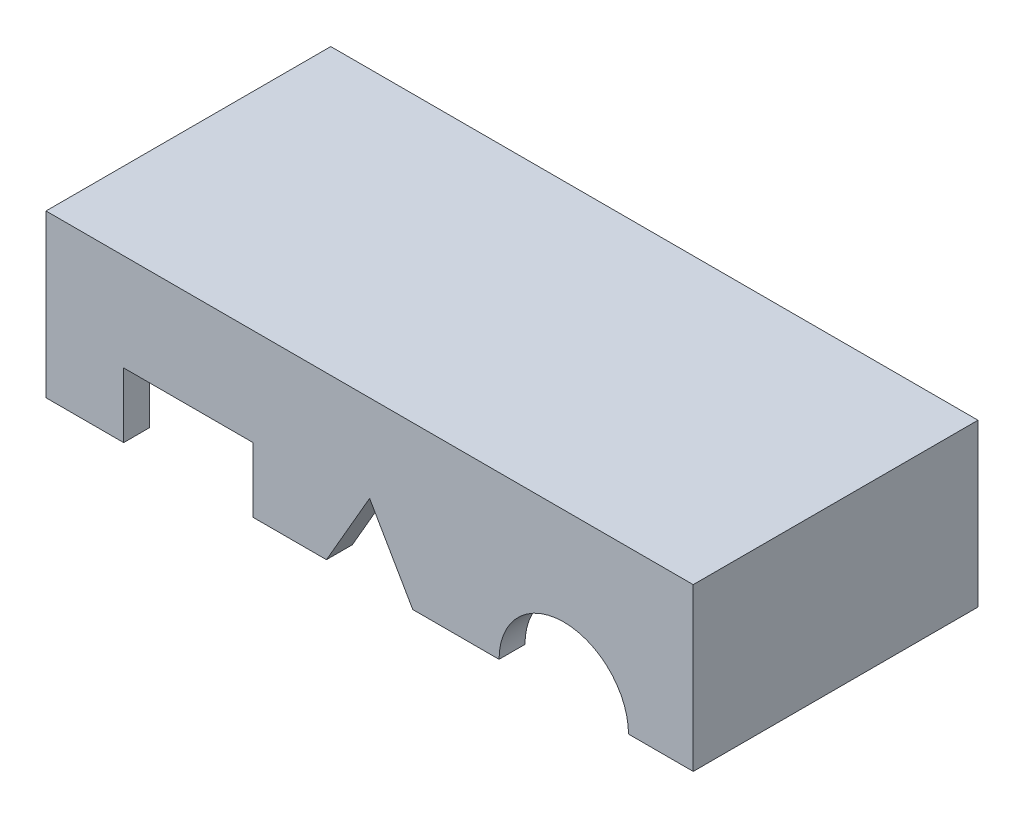
ISO-10303-21;
HEADER;
FILE_DESCRIPTION(('STEP AP214'),'2;1');
FILE_NAME('part.step','',(''),(''),'','','');
FILE_SCHEMA(('AUTOMOTIVE_DESIGN { 1 0 10303 214 1 1 1 1 }'));
ENDSEC;
DATA;
#1=APPLICATION_CONTEXT('core data for automotive mechanical design processes');
#2=APPLICATION_PROTOCOL_DEFINITION('international standard','automotive_design',2000,#1);
#3=PRODUCT_CONTEXT('',#1,'mechanical');
#4=PRODUCT('Part','Part','',(#3));
#5=PRODUCT_RELATED_PRODUCT_CATEGORY('part','',(#4));
#6=PRODUCT_DEFINITION_FORMATION('','',#4);
#7=PRODUCT_DEFINITION_CONTEXT('part definition',#1,'design');
#8=PRODUCT_DEFINITION('design','',#6,#7);
#9=PRODUCT_DEFINITION_SHAPE('','',#8);
#10=(LENGTH_UNIT() NAMED_UNIT(*) SI_UNIT(.MILLI.,.METRE.));
#11=(NAMED_UNIT(*) PLANE_ANGLE_UNIT() SI_UNIT($,.RADIAN.));
#12=(NAMED_UNIT(*) SI_UNIT($,.STERADIAN.) SOLID_ANGLE_UNIT());
#13=UNCERTAINTY_MEASURE_WITH_UNIT(LENGTH_MEASURE(1.E-05),#10,'distance_accuracy_value','');
#14=(GEOMETRIC_REPRESENTATION_CONTEXT(3) GLOBAL_UNCERTAINTY_ASSIGNED_CONTEXT((#13)) GLOBAL_UNIT_ASSIGNED_CONTEXT((#10,
#11,#12)) REPRESENTATION_CONTEXT('',''));
#15=CARTESIAN_POINT('',(0.,0.,0.));
#16=DIRECTION('',(0.,0.,1.));
#17=DIRECTION('',(1.,0.,0.));
#18=AXIS2_PLACEMENT_3D('',#15,#16,#17);
#19=CARTESIAN_POINT('',(0.,0.,0.));
#20=DIRECTION('',(0.,0.,1.));
#21=DIRECTION('',(1.,0.,0.));
#22=AXIS2_PLACEMENT_3D('',#19,#20,#21);
#23=PLANE('',#22);
#24=DIRECTION('',(0.,1.,0.));
#25=VECTOR('',#24,1.);
#26=CARTESIAN_POINT('',(125.,-62.5,0.));
#27=LINE('',#26,#25);
#28=CARTESIAN_POINT('',(125.,0.,0.));
#29=VERTEX_POINT('',#28);
#30=CARTESIAN_POINT('',(125.,62.5,0.));
#31=VERTEX_POINT('',#30);
#32=EDGE_CURVE('E250',#29,#31,#27,.T.);
#33=ORIENTED_EDGE('',*,*,#32,.F.);
#34=DIRECTION('',(-1.,0.,0.));
#35=VECTOR('',#34,1.);
#36=CARTESIAN_POINT('',(0.,0.,0.));
#37=LINE('',#36,#35);
#38=CARTESIAN_POINT('',(115.,0.,0.));
#39=VERTEX_POINT('',#38);
#40=EDGE_CURVE('E330',#29,#39,#37,.T.);
#41=ORIENTED_EDGE('',*,*,#40,.T.);
#42=DIRECTION('',(0.,1.,0.));
#43=VECTOR('',#42,1.);
#44=CARTESIAN_POINT('',(115.,-57.5,0.));
#45=LINE('',#44,#43);
#46=CARTESIAN_POINT('',(115.,57.5,0.));
#47=VERTEX_POINT('',#46);
#48=EDGE_CURVE('E233',#39,#47,#45,.T.);
#49=ORIENTED_EDGE('',*,*,#48,.T.);
#50=DIRECTION('',(-1.,0.,0.));
#51=VECTOR('',#50,1.);
#52=CARTESIAN_POINT('',(115.,57.5,0.));
#53=LINE('',#52,#51);
#54=CARTESIAN_POINT('',(-115.,57.5,0.));
#55=VERTEX_POINT('',#54);
#56=EDGE_CURVE('E222',#47,#55,#53,.T.);
#57=ORIENTED_EDGE('',*,*,#56,.T.);
#58=DIRECTION('',(0.,-1.,0.));
#59=VECTOR('',#58,1.);
#60=CARTESIAN_POINT('',(-115.,-57.5,0.));
#61=LINE('',#60,#59);
#62=CARTESIAN_POINT('',(-115.,0.,0.));
#63=VERTEX_POINT('',#62);
#64=EDGE_CURVE('E209',#55,#63,#61,.T.);
#65=ORIENTED_EDGE('',*,*,#64,.T.);
#66=CARTESIAN_POINT('',(-125.,0.,0.));
#67=VERTEX_POINT('',#66);
#68=EDGE_CURVE('E275',#63,#67,#37,.T.);
#69=ORIENTED_EDGE('',*,*,#68,.T.);
#70=DIRECTION('',(0.,-1.,0.));
#71=VECTOR('',#70,1.);
#72=CARTESIAN_POINT('',(-125.,-62.5,0.));
#73=LINE('',#72,#71);
#74=CARTESIAN_POINT('',(-125.,62.5,0.));
#75=VERTEX_POINT('',#74);
#76=EDGE_CURVE('E246',#75,#67,#73,.T.);
#77=ORIENTED_EDGE('',*,*,#76,.F.);
#78=DIRECTION('',(-1.,0.,0.));
#79=VECTOR('',#78,1.);
#80=CARTESIAN_POINT('',(125.,62.5,0.));
#81=LINE('',#80,#79);
#82=EDGE_CURVE('E253',#31,#75,#81,.T.);
#83=ORIENTED_EDGE('',*,*,#82,.F.);
#84=EDGE_LOOP('',(#33,#41,#49,#57,#65,#69,#77,#83));
#85=FACE_BOUND('',#84,.T.);
#86=ADVANCED_FACE('F43',(#85),#23,.F.);
#87=CARTESIAN_POINT('',(-125.,-62.5,100.));
#88=DIRECTION('',(1.,0.,0.));
#89=DIRECTION('',(0.,0.,-1.));
#90=AXIS2_PLACEMENT_3D('',#87,#88,#89);
#91=PLANE('',#90);
#92=ORIENTED_EDGE('',*,*,#76,.T.);
#93=DIRECTION('',(0.,0.,1.));
#94=VECTOR('',#93,1.);
#95=CARTESIAN_POINT('',(-125.,0.,100.));
#96=LINE('',#95,#94);
#97=CARTESIAN_POINT('',(-125.,0.,110.));
#98=VERTEX_POINT('',#97);
#99=EDGE_CURVE('E279',#67,#98,#96,.T.);
#100=ORIENTED_EDGE('',*,*,#99,.T.);
#101=DIRECTION('',(0.,-1.,0.));
#102=VECTOR('',#101,1.);
#103=CARTESIAN_POINT('',(-125.,0.,110.));
#104=LINE('',#103,#102);
#105=CARTESIAN_POINT('',(-125.,62.5,110.));
#106=VERTEX_POINT('',#105);
#107=EDGE_CURVE('E281',#106,#98,#104,.T.);
#108=ORIENTED_EDGE('',*,*,#107,.F.);
#109=DIRECTION('',(0.,0.,-1.));
#110=VECTOR('',#109,1.);
#111=CARTESIAN_POINT('',(-125.,62.5,100.));
#112=LINE('',#111,#110);
#113=EDGE_CURVE('E256',#106,#75,#112,.T.);
#114=ORIENTED_EDGE('',*,*,#113,.T.);
#115=EDGE_LOOP('',(#92,#100,#108,#114));
#116=FACE_BOUND('',#115,.T.);
#117=ADVANCED_FACE('F45',(#116),#91,.F.);
#118=CARTESIAN_POINT('',(125.,-62.5,100.));
#119=DIRECTION('',(-1.,0.,0.));
#120=DIRECTION('',(0.,0.,1.));
#121=AXIS2_PLACEMENT_3D('',#118,#119,#120);
#122=PLANE('',#121);
#123=DIRECTION('',(0.,1.,0.));
#124=VECTOR('',#123,1.);
#125=CARTESIAN_POINT('',(125.,0.,110.));
#126=LINE('',#125,#124);
#127=CARTESIAN_POINT('',(125.,0.,110.));
#128=VERTEX_POINT('',#127);
#129=CARTESIAN_POINT('',(125.,62.5,110.));
#130=VERTEX_POINT('',#129);
#131=EDGE_CURVE('E214',#128,#130,#126,.T.);
#132=ORIENTED_EDGE('',*,*,#131,.F.);
#133=DIRECTION('',(0.,0.,-1.));
#134=VECTOR('',#133,1.);
#135=CARTESIAN_POINT('',(125.,0.,100.));
#136=LINE('',#135,#134);
#137=EDGE_CURVE('E300',#128,#29,#136,.T.);
#138=ORIENTED_EDGE('',*,*,#137,.T.);
#139=ORIENTED_EDGE('',*,*,#32,.T.);
#140=DIRECTION('',(0.,0.,-1.));
#141=VECTOR('',#140,1.);
#142=CARTESIAN_POINT('',(125.,62.5,100.));
#143=LINE('',#142,#141);
#144=EDGE_CURVE('E174',#130,#31,#143,.T.);
#145=ORIENTED_EDGE('',*,*,#144,.F.);
#146=EDGE_LOOP('',(#132,#138,#139,#145));
#147=FACE_BOUND('',#146,.T.);
#148=ADVANCED_FACE('F396',(#147),#122,.F.);
#149=CARTESIAN_POINT('',(125.,62.5,100.));
#150=DIRECTION('',(0.,-1.,0.));
#151=DIRECTION('',(1.,0.,0.));
#152=AXIS2_PLACEMENT_3D('',#149,#150,#151);
#153=PLANE('',#152);
#154=ORIENTED_EDGE('',*,*,#82,.T.);
#155=ORIENTED_EDGE('',*,*,#113,.F.);
#156=DIRECTION('',(-1.,0.,0.));
#157=VECTOR('',#156,1.);
#158=CARTESIAN_POINT('',(0.,62.5,110.));
#159=LINE('',#158,#157);
#160=EDGE_CURVE('E267',#130,#106,#159,.T.);
#161=ORIENTED_EDGE('',*,*,#160,.F.);
#162=ORIENTED_EDGE('',*,*,#144,.T.);
#163=EDGE_LOOP('',(#154,#155,#161,#162));
#164=FACE_BOUND('',#163,.T.);
#165=ADVANCED_FACE('F265',(#164),#153,.F.);
#166=CARTESIAN_POINT('',(-115.,-57.5,100.));
#167=DIRECTION('',(1.,0.,0.));
#168=DIRECTION('',(0.,0.,-1.));
#169=AXIS2_PLACEMENT_3D('',#166,#167,#168);
#170=PLANE('',#169);
#171=DIRECTION('',(0.,0.,1.));
#172=VECTOR('',#171,1.);
#173=CARTESIAN_POINT('',(-115.,0.,100.));
#174=LINE('',#173,#172);
#175=CARTESIAN_POINT('',(-115.,0.,100.));
#176=VERTEX_POINT('',#175);
#177=EDGE_CURVE('E168',#63,#176,#174,.T.);
#178=ORIENTED_EDGE('',*,*,#177,.F.);
#179=ORIENTED_EDGE('',*,*,#64,.F.);
#180=DIRECTION('',(0.,0.,-1.));
#181=VECTOR('',#180,1.);
#182=CARTESIAN_POINT('',(-115.,57.5,100.));
#183=LINE('',#182,#181);
#184=CARTESIAN_POINT('',(-115.,57.5,100.));
#185=VERTEX_POINT('',#184);
#186=EDGE_CURVE('E229',#185,#55,#183,.T.);
#187=ORIENTED_EDGE('',*,*,#186,.F.);
#188=DIRECTION('',(0.,-1.,0.));
#189=VECTOR('',#188,1.);
#190=CARTESIAN_POINT('',(-115.,-57.5,100.));
#191=LINE('',#190,#189);
#192=EDGE_CURVE('E218',#185,#176,#191,.T.);
#193=ORIENTED_EDGE('',*,*,#192,.T.);
#194=EDGE_LOOP('',(#178,#179,#187,#193));
#195=FACE_BOUND('',#194,.T.);
#196=ADVANCED_FACE('F399',(#195),#170,.T.);
#197=CARTESIAN_POINT('',(115.,-57.5,100.));
#198=DIRECTION('',(-1.,0.,0.));
#199=DIRECTION('',(0.,0.,1.));
#200=AXIS2_PLACEMENT_3D('',#197,#198,#199);
#201=PLANE('',#200);
#202=DIRECTION('',(0.,0.,-1.));
#203=VECTOR('',#202,1.);
#204=CARTESIAN_POINT('',(115.,0.,100.));
#205=LINE('',#204,#203);
#206=CARTESIAN_POINT('',(115.,0.,100.));
#207=VERTEX_POINT('',#206);
#208=EDGE_CURVE('E327',#207,#39,#205,.T.);
#209=ORIENTED_EDGE('',*,*,#208,.F.);
#210=DIRECTION('',(0.,1.,0.));
#211=VECTOR('',#210,1.);
#212=CARTESIAN_POINT('',(115.,-57.5,100.));
#213=LINE('',#212,#211);
#214=CARTESIAN_POINT('',(115.,57.5,100.));
#215=VERTEX_POINT('',#214);
#216=EDGE_CURVE('E221',#207,#215,#213,.T.);
#217=ORIENTED_EDGE('',*,*,#216,.T.);
#218=DIRECTION('',(0.,0.,-1.));
#219=VECTOR('',#218,1.);
#220=CARTESIAN_POINT('',(115.,57.5,100.));
#221=LINE('',#220,#219);
#222=EDGE_CURVE('E242',#215,#47,#221,.T.);
#223=ORIENTED_EDGE('',*,*,#222,.T.);
#224=ORIENTED_EDGE('',*,*,#48,.F.);
#225=EDGE_LOOP('',(#209,#217,#223,#224));
#226=FACE_BOUND('',#225,.T.);
#227=ADVANCED_FACE('F418',(#226),#201,.T.);
#228=CARTESIAN_POINT('',(115.,57.5,100.));
#229=DIRECTION('',(0.,-1.,0.));
#230=DIRECTION('',(0.,0.,-1.));
#231=AXIS2_PLACEMENT_3D('',#228,#229,#230);
#232=PLANE('',#231);
#233=ORIENTED_EDGE('',*,*,#56,.F.);
#234=ORIENTED_EDGE('',*,*,#222,.F.);
#235=DIRECTION('',(-1.,0.,0.));
#236=VECTOR('',#235,1.);
#237=CARTESIAN_POINT('',(115.,57.5,100.));
#238=LINE('',#237,#236);
#239=EDGE_CURVE('E225',#215,#185,#238,.T.);
#240=ORIENTED_EDGE('',*,*,#239,.T.);
#241=ORIENTED_EDGE('',*,*,#186,.T.);
#242=EDGE_LOOP('',(#233,#234,#240,#241));
#243=FACE_BOUND('',#242,.T.);
#244=ADVANCED_FACE('F425',(#243),#232,.T.);
#245=CARTESIAN_POINT('',(12.5,7.21687836487032,110.));
#246=DIRECTION('',(0.866025403784439,0.5,0.));
#247=DIRECTION('',(-0.5,0.866025403784439,0.));
#248=AXIS2_PLACEMENT_3D('',#245,#246,#247);
#249=PLANE('',#248);
#250=DIRECTION('',(0.5,-0.866025403784439,0.));
#251=VECTOR('',#250,1.);
#252=CARTESIAN_POINT('',(12.5,7.21687836487032,100.));
#253=LINE('',#252,#251);
#254=CARTESIAN_POINT('',(0.,28.8675134594813,100.));
#255=VERTEX_POINT('',#254);
#256=CARTESIAN_POINT('',(16.6666666666667,0.,100.));
#257=VERTEX_POINT('',#256);
#258=EDGE_CURVE('E190',#255,#257,#253,.T.);
#259=ORIENTED_EDGE('',*,*,#258,.T.);
#260=DIRECTION('',(0.,0.,1.));
#261=VECTOR('',#260,1.);
#262=CARTESIAN_POINT('',(16.6666666666667,0.,110.));
#263=LINE('',#262,#261);
#264=CARTESIAN_POINT('',(16.6666666666667,0.,110.));
#265=VERTEX_POINT('',#264);
#266=EDGE_CURVE('E60',#257,#265,#263,.T.);
#267=ORIENTED_EDGE('',*,*,#266,.T.);
#268=DIRECTION('',(0.5,-0.866025403784439,0.));
#269=VECTOR('',#268,1.);
#270=CARTESIAN_POINT('',(12.5,7.21687836487032,110.));
#271=LINE('',#270,#269);
#272=CARTESIAN_POINT('',(0.,28.8675134594813,110.));
#273=VERTEX_POINT('',#272);
#274=EDGE_CURVE('E291',#273,#265,#271,.T.);
#275=ORIENTED_EDGE('',*,*,#274,.F.);
#276=DIRECTION('',(0.,0.,-1.));
#277=VECTOR('',#276,1.);
#278=CARTESIAN_POINT('',(0.,28.8675134594813,110.));
#279=LINE('',#278,#277);
#280=EDGE_CURVE('E205',#273,#255,#279,.T.);
#281=ORIENTED_EDGE('',*,*,#280,.T.);
#282=EDGE_LOOP('',(#259,#267,#275,#281));
#283=FACE_BOUND('',#282,.T.);
#284=ADVANCED_FACE('F370',(#283),#249,.F.);
#285=CARTESIAN_POINT('',(0.,25.,110.));
#286=DIRECTION('',(0.,1.,0.));
#287=DIRECTION('',(0.,0.,1.));
#288=AXIS2_PLACEMENT_3D('',#285,#286,#287);
#289=PLANE('',#288);
#290=DIRECTION('',(1.,0.,0.));
#291=VECTOR('',#290,1.);
#292=CARTESIAN_POINT('',(0.,25.,100.));
#293=LINE('',#292,#291);
#294=CARTESIAN_POINT('',(-95.,25.,100.));
#295=VERTEX_POINT('',#294);
#296=CARTESIAN_POINT('',(-45.,25.,100.));
#297=VERTEX_POINT('',#296);
#298=EDGE_CURVE('E188',#295,#297,#293,.T.);
#299=ORIENTED_EDGE('',*,*,#298,.T.);
#300=DIRECTION('',(0.,0.,-1.));
#301=VECTOR('',#300,1.);
#302=CARTESIAN_POINT('',(-45.,25.,110.));
#303=LINE('',#302,#301);
#304=CARTESIAN_POINT('',(-45.,25.,110.));
#305=VERTEX_POINT('',#304);
#306=EDGE_CURVE('E210',#305,#297,#303,.T.);
#307=ORIENTED_EDGE('',*,*,#306,.F.);
#308=DIRECTION('',(1.,0.,0.));
#309=VECTOR('',#308,1.);
#310=CARTESIAN_POINT('',(0.,25.,110.));
#311=LINE('',#310,#309);
#312=CARTESIAN_POINT('',(-95.,25.,110.));
#313=VERTEX_POINT('',#312);
#314=EDGE_CURVE('E307',#313,#305,#311,.T.);
#315=ORIENTED_EDGE('',*,*,#314,.F.);
#316=DIRECTION('',(0.,0.,-1.));
#317=VECTOR('',#316,1.);
#318=CARTESIAN_POINT('',(-95.,25.,110.));
#319=LINE('',#318,#317);
#320=EDGE_CURVE('E211',#313,#295,#319,.T.);
#321=ORIENTED_EDGE('',*,*,#320,.T.);
#322=EDGE_LOOP('',(#299,#307,#315,#321));
#323=FACE_BOUND('',#322,.T.);
#324=ADVANCED_FACE('F304',(#323),#289,.F.);
#325=CARTESIAN_POINT('',(-45.,0.,110.));
#326=DIRECTION('',(1.,0.,0.));
#327=DIRECTION('',(0.,1.,0.));
#328=AXIS2_PLACEMENT_3D('',#325,#326,#327);
#329=PLANE('',#328);
#330=DIRECTION('',(0.,-1.,0.));
#331=VECTOR('',#330,1.);
#332=CARTESIAN_POINT('',(-45.,0.,100.));
#333=LINE('',#332,#331);
#334=CARTESIAN_POINT('',(-45.,0.,100.));
#335=VERTEX_POINT('',#334);
#336=EDGE_CURVE('E191',#297,#335,#333,.T.);
#337=ORIENTED_EDGE('',*,*,#336,.T.);
#338=DIRECTION('',(0.,0.,1.));
#339=VECTOR('',#338,1.);
#340=CARTESIAN_POINT('',(-45.,0.,110.));
#341=LINE('',#340,#339);
#342=CARTESIAN_POINT('',(-45.,0.,110.));
#343=VERTEX_POINT('',#342);
#344=EDGE_CURVE('E68',#335,#343,#341,.T.);
#345=ORIENTED_EDGE('',*,*,#344,.T.);
#346=DIRECTION('',(0.,-1.,0.));
#347=VECTOR('',#346,1.);
#348=CARTESIAN_POINT('',(-45.,0.,110.));
#349=LINE('',#348,#347);
#350=EDGE_CURVE('E310',#305,#343,#349,.T.);
#351=ORIENTED_EDGE('',*,*,#350,.F.);
#352=ORIENTED_EDGE('',*,*,#306,.T.);
#353=EDGE_LOOP('',(#337,#345,#351,#352));
#354=FACE_BOUND('',#353,.T.);
#355=ADVANCED_FACE('F377',(#354),#329,.F.);
#356=CARTESIAN_POINT('',(-12.5,7.21687836487033,110.));
#357=DIRECTION('',(-0.866025403784439,0.5,0.));
#358=DIRECTION('',(-0.5,-0.866025403784439,0.));
#359=AXIS2_PLACEMENT_3D('',#356,#357,#358);
#360=PLANE('',#359);
#361=DIRECTION('',(0.5,0.866025403784439,0.));
#362=VECTOR('',#361,1.);
#363=CARTESIAN_POINT('',(-12.5,7.21687836487033,110.));
#364=LINE('',#363,#362);
#365=CARTESIAN_POINT('',(-16.6666666666667,0.,110.));
#366=VERTEX_POINT('',#365);
#367=EDGE_CURVE('E288',#366,#273,#364,.T.);
#368=ORIENTED_EDGE('',*,*,#367,.F.);
#369=DIRECTION('',(0.,0.,-1.));
#370=VECTOR('',#369,1.);
#371=CARTESIAN_POINT('',(-16.6666666666667,0.,110.));
#372=LINE('',#371,#370);
#373=CARTESIAN_POINT('',(-16.6666666666667,0.,100.));
#374=VERTEX_POINT('',#373);
#375=EDGE_CURVE('E343',#366,#374,#372,.T.);
#376=ORIENTED_EDGE('',*,*,#375,.T.);
#377=DIRECTION('',(0.5,0.866025403784439,0.));
#378=VECTOR('',#377,1.);
#379=CARTESIAN_POINT('',(-12.5,7.21687836487033,100.));
#380=LINE('',#379,#378);
#381=EDGE_CURVE('E196',#374,#255,#380,.T.);
#382=ORIENTED_EDGE('',*,*,#381,.T.);
#383=ORIENTED_EDGE('',*,*,#280,.F.);
#384=EDGE_LOOP('',(#368,#376,#382,#383));
#385=FACE_BOUND('',#384,.T.);
#386=ADVANCED_FACE('F381',(#385),#360,.F.);
#387=CARTESIAN_POINT('',(-95.,0.,110.));
#388=DIRECTION('',(1.,0.,0.));
#389=DIRECTION('',(0.,0.,-1.));
#390=AXIS2_PLACEMENT_3D('',#387,#388,#389);
#391=PLANE('',#390);
#392=DIRECTION('',(0.,0.,1.));
#393=VECTOR('',#392,1.);
#394=CARTESIAN_POINT('',(-95.,0.,110.));
#395=LINE('',#394,#393);
#396=CARTESIAN_POINT('',(-95.,0.,100.));
#397=VERTEX_POINT('',#396);
#398=CARTESIAN_POINT('',(-95.,0.,110.));
#399=VERTEX_POINT('',#398);
#400=EDGE_CURVE('E165',#397,#399,#395,.T.);
#401=ORIENTED_EDGE('',*,*,#400,.F.);
#402=DIRECTION('',(0.,-1.,0.));
#403=VECTOR('',#402,1.);
#404=CARTESIAN_POINT('',(-95.,0.,100.));
#405=LINE('',#404,#403);
#406=EDGE_CURVE('E179',#295,#397,#405,.T.);
#407=ORIENTED_EDGE('',*,*,#406,.F.);
#408=ORIENTED_EDGE('',*,*,#320,.F.);
#409=DIRECTION('',(0.,-1.,0.));
#410=VECTOR('',#409,1.);
#411=CARTESIAN_POINT('',(-95.,0.,110.));
#412=LINE('',#411,#410);
#413=EDGE_CURVE('E181',#313,#399,#412,.T.);
#414=ORIENTED_EDGE('',*,*,#413,.T.);
#415=EDGE_LOOP('',(#401,#407,#408,#414));
#416=FACE_BOUND('',#415,.T.);
#417=ADVANCED_FACE('F178',(#416),#391,.T.);
#418=CARTESIAN_POINT('',(74.9999999999999,0.,110.));
#419=DIRECTION('',(0.,0.,-1.));
#420=DIRECTION('',(-1.,0.,0.));
#421=AXIS2_PLACEMENT_3D('',#418,#419,#420);
#422=CYLINDRICAL_SURFACE('',#421,25.);
#423=DIRECTION('',(0.,0.,-1.));
#424=VECTOR('',#423,1.);
#425=CARTESIAN_POINT('',(99.9999999999999,0.,110.));
#426=LINE('',#425,#424);
#427=CARTESIAN_POINT('',(99.9999999999999,0.,110.));
#428=VERTEX_POINT('',#427);
#429=CARTESIAN_POINT('',(99.9999999999999,0.,100.));
#430=VERTEX_POINT('',#429);
#431=EDGE_CURVE('E331',#428,#430,#426,.T.);
#432=ORIENTED_EDGE('',*,*,#431,.F.);
#433=CARTESIAN_POINT('',(74.9999999999999,0.,110.));
#434=DIRECTION('',(0.,0.,1.));
#435=DIRECTION('',(1.,0.,0.));
#436=AXIS2_PLACEMENT_3D('',#433,#434,#435);
#437=CIRCLE('',#436,25.);
#438=CARTESIAN_POINT('',(49.9999999999999,0.,110.));
#439=VERTEX_POINT('',#438);
#440=EDGE_CURVE('E204',#428,#439,#437,.T.);
#441=ORIENTED_EDGE('',*,*,#440,.T.);
#442=DIRECTION('',(0.,0.,-1.));
#443=VECTOR('',#442,1.);
#444=CARTESIAN_POINT('',(49.9999999999999,0.,110.));
#445=LINE('',#444,#443);
#446=CARTESIAN_POINT('',(49.9999999999999,0.,100.));
#447=VERTEX_POINT('',#446);
#448=EDGE_CURVE('E337',#447,#439,#445,.F.);
#449=ORIENTED_EDGE('',*,*,#448,.F.);
#450=CARTESIAN_POINT('',(74.9999999999999,0.,100.));
#451=DIRECTION('',(0.,0.,1.));
#452=DIRECTION('',(1.,0.,0.));
#453=AXIS2_PLACEMENT_3D('',#450,#451,#452);
#454=CIRCLE('',#453,25.);
#455=EDGE_CURVE('E297',#430,#447,#454,.T.);
#456=ORIENTED_EDGE('',*,*,#455,.F.);
#457=EDGE_LOOP('',(#432,#441,#449,#456));
#458=FACE_BOUND('',#457,.T.);
#459=ADVANCED_FACE('F364',(#458),#422,.F.);
#460=CARTESIAN_POINT('',(0.,0.,110.));
#461=DIRECTION('',(0.,0.,1.));
#462=DIRECTION('',(1.,0.,0.));
#463=AXIS2_PLACEMENT_3D('',#460,#461,#462);
#464=PLANE('',#463);
#465=DIRECTION('',(-1.,0.,0.));
#466=VECTOR('',#465,1.);
#467=CARTESIAN_POINT('',(0.,0.,110.));
#468=LINE('',#467,#466);
#469=EDGE_CURVE('E326',#128,#428,#468,.T.);
#470=ORIENTED_EDGE('',*,*,#469,.F.);
#471=ORIENTED_EDGE('',*,*,#131,.T.);
#472=ORIENTED_EDGE('',*,*,#160,.T.);
#473=ORIENTED_EDGE('',*,*,#107,.T.);
#474=EDGE_CURVE('E312',#399,#98,#468,.T.);
#475=ORIENTED_EDGE('',*,*,#474,.F.);
#476=ORIENTED_EDGE('',*,*,#413,.F.);
#477=ORIENTED_EDGE('',*,*,#314,.T.);
#478=ORIENTED_EDGE('',*,*,#350,.T.);
#479=EDGE_CURVE('E340',#366,#343,#468,.T.);
#480=ORIENTED_EDGE('',*,*,#479,.F.);
#481=ORIENTED_EDGE('',*,*,#367,.T.);
#482=ORIENTED_EDGE('',*,*,#274,.T.);
#483=EDGE_CURVE('E334',#439,#265,#468,.T.);
#484=ORIENTED_EDGE('',*,*,#483,.F.);
#485=ORIENTED_EDGE('',*,*,#440,.F.);
#486=EDGE_LOOP('',(#470,#471,#472,#473,#475,#476,#477,#478,#480,#481,#482,#484,#485));
#487=FACE_BOUND('',#486,.T.);
#488=ADVANCED_FACE('F286',(#487),#464,.T.);
#489=CARTESIAN_POINT('',(0.,0.,100.));
#490=DIRECTION('',(0.,0.,1.));
#491=DIRECTION('',(1.,0.,0.));
#492=AXIS2_PLACEMENT_3D('',#489,#490,#491);
#493=PLANE('',#492);
#494=ORIENTED_EDGE('',*,*,#216,.F.);
#495=DIRECTION('',(-1.,0.,0.));
#496=VECTOR('',#495,1.);
#497=CARTESIAN_POINT('',(0.,0.,100.));
#498=LINE('',#497,#496);
#499=EDGE_CURVE('E11',#207,#430,#498,.T.);
#500=ORIENTED_EDGE('',*,*,#499,.T.);
#501=ORIENTED_EDGE('',*,*,#455,.T.);
#502=EDGE_CURVE('E53',#447,#257,#498,.T.);
#503=ORIENTED_EDGE('',*,*,#502,.T.);
#504=ORIENTED_EDGE('',*,*,#258,.F.);
#505=ORIENTED_EDGE('',*,*,#381,.F.);
#506=EDGE_CURVE('E173',#374,#335,#498,.T.);
#507=ORIENTED_EDGE('',*,*,#506,.T.);
#508=ORIENTED_EDGE('',*,*,#336,.F.);
#509=ORIENTED_EDGE('',*,*,#298,.F.);
#510=ORIENTED_EDGE('',*,*,#406,.T.);
#511=EDGE_CURVE('E47',#397,#176,#498,.T.);
#512=ORIENTED_EDGE('',*,*,#511,.T.);
#513=ORIENTED_EDGE('',*,*,#192,.F.);
#514=ORIENTED_EDGE('',*,*,#239,.F.);
#515=EDGE_LOOP('',(#494,#500,#501,#503,#504,#505,#507,#508,#509,#510,#512,#513,#514));
#516=FACE_BOUND('',#515,.T.);
#517=ADVANCED_FACE('F186',(#516),#493,.F.);
#518=CARTESIAN_POINT('',(-138.233831443166,0.,375.46845739689));
#519=DIRECTION('',(0.,1.,0.));
#520=DIRECTION('',(0.,0.,1.));
#521=AXIS2_PLACEMENT_3D('',#518,#519,#520);
#522=PLANE('',#521);
#523=ORIENTED_EDGE('',*,*,#99,.F.);
#524=ORIENTED_EDGE('',*,*,#68,.F.);
#525=ORIENTED_EDGE('',*,*,#177,.T.);
#526=ORIENTED_EDGE('',*,*,#511,.F.);
#527=ORIENTED_EDGE('',*,*,#400,.T.);
#528=ORIENTED_EDGE('',*,*,#474,.T.);
#529=EDGE_LOOP('',(#523,#524,#525,#526,#527,#528));
#530=FACE_BOUND('',#529,.T.);
#531=ADVANCED_FACE('F164',(#530),#522,.F.);
#532=ORIENTED_EDGE('',*,*,#375,.F.);
#533=ORIENTED_EDGE('',*,*,#479,.T.);
#534=ORIENTED_EDGE('',*,*,#344,.F.);
#535=ORIENTED_EDGE('',*,*,#506,.F.);
#536=EDGE_LOOP('',(#532,#533,#534,#535));
#537=FACE_BOUND('',#536,.T.);
#538=ADVANCED_FACE('F382',(#537),#522,.F.);
#539=ORIENTED_EDGE('',*,*,#448,.T.);
#540=ORIENTED_EDGE('',*,*,#483,.T.);
#541=ORIENTED_EDGE('',*,*,#266,.F.);
#542=ORIENTED_EDGE('',*,*,#502,.F.);
#543=EDGE_LOOP('',(#539,#540,#541,#542));
#544=FACE_BOUND('',#543,.T.);
#545=ADVANCED_FACE('F368',(#544),#522,.F.);
#546=ORIENTED_EDGE('',*,*,#137,.F.);
#547=ORIENTED_EDGE('',*,*,#469,.T.);
#548=ORIENTED_EDGE('',*,*,#431,.T.);
#549=ORIENTED_EDGE('',*,*,#499,.F.);
#550=ORIENTED_EDGE('',*,*,#208,.T.);
#551=ORIENTED_EDGE('',*,*,#40,.F.);
#552=EDGE_LOOP('',(#546,#547,#548,#549,#550,#551));
#553=FACE_BOUND('',#552,.T.);
#554=ADVANCED_FACE('F360',(#553),#522,.F.);
#555=CLOSED_SHELL('',(#86,#117,#148,#165,#196,#227,#244,#284,#324,#355,#386,#417,#459,#488,#517,
#531,#538,#545,#554));
#556=MANIFOLD_SOLID_BREP('B2',#555);
#557=ADVANCED_BREP_SHAPE_REPRESENTATION('',(#18,#556),#14);
#558=SHAPE_DEFINITION_REPRESENTATION(#9,#557);
ENDSEC;
END-ISO-10303-21;
